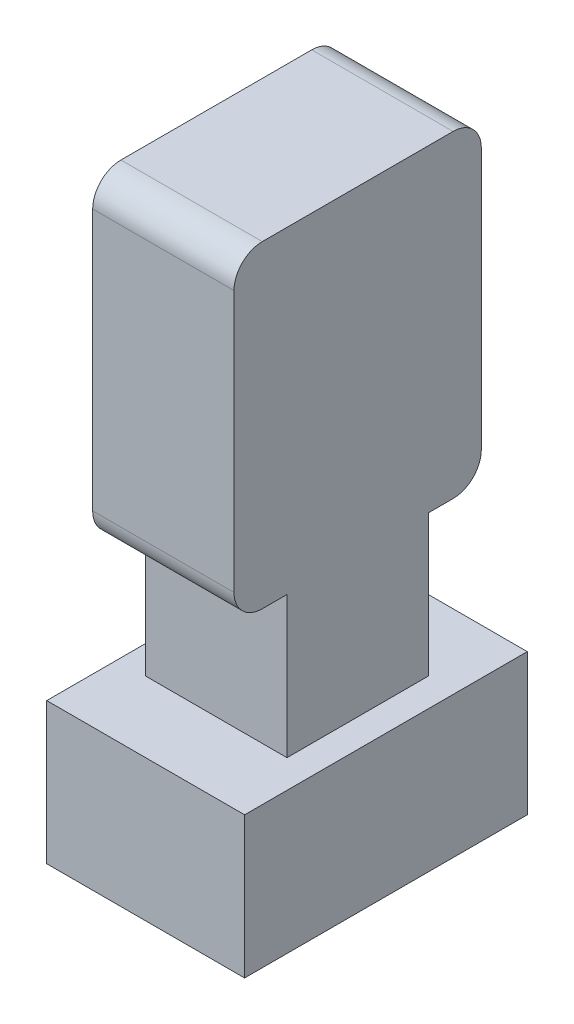
ISO-10303-21;
HEADER;
FILE_DESCRIPTION(('STEP AP214'),'2;1');
FILE_NAME('part.step','',(''),(''),'','','');
FILE_SCHEMA(('AUTOMOTIVE_DESIGN { 1 0 10303 214 1 1 1 1 }'));
ENDSEC;
DATA;
#1=APPLICATION_CONTEXT('core data for automotive mechanical design processes');
#2=APPLICATION_PROTOCOL_DEFINITION('international standard','automotive_design',2000,#1);
#3=PRODUCT_CONTEXT('',#1,'mechanical');
#4=PRODUCT('Part','Part','',(#3));
#5=PRODUCT_RELATED_PRODUCT_CATEGORY('part','',(#4));
#6=PRODUCT_DEFINITION_FORMATION('','',#4);
#7=PRODUCT_DEFINITION_CONTEXT('part definition',#1,'design');
#8=PRODUCT_DEFINITION('design','',#6,#7);
#9=PRODUCT_DEFINITION_SHAPE('','',#8);
#10=(LENGTH_UNIT() NAMED_UNIT(*) SI_UNIT(.MILLI.,.METRE.));
#11=(NAMED_UNIT(*) PLANE_ANGLE_UNIT() SI_UNIT($,.RADIAN.));
#12=(NAMED_UNIT(*) SI_UNIT($,.STERADIAN.) SOLID_ANGLE_UNIT());
#13=UNCERTAINTY_MEASURE_WITH_UNIT(LENGTH_MEASURE(1.E-05),#10,'distance_accuracy_value','');
#14=(GEOMETRIC_REPRESENTATION_CONTEXT(3) GLOBAL_UNCERTAINTY_ASSIGNED_CONTEXT((#13)) GLOBAL_UNIT_ASSIGNED_CONTEXT((#10,
#11,#12)) REPRESENTATION_CONTEXT('',''));
#15=CARTESIAN_POINT('',(0.,0.,0.));
#16=DIRECTION('',(0.,0.,1.));
#17=DIRECTION('',(1.,0.,0.));
#18=AXIS2_PLACEMENT_3D('',#15,#16,#17);
#19=CARTESIAN_POINT('',(0.,10.,0.));
#20=DIRECTION('',(0.,-1.,0.));
#21=DIRECTION('',(0.,0.,-1.));
#22=AXIS2_PLACEMENT_3D('',#19,#20,#21);
#23=PLANE('',#22);
#24=DIRECTION('',(0.,0.,1.));
#25=VECTOR('',#24,1.);
#26=CARTESIAN_POINT('',(0.,10.,0.));
#27=LINE('',#26,#25);
#28=CARTESIAN_POINT('',(0.,10.,-20.));
#29=VERTEX_POINT('',#28);
#30=CARTESIAN_POINT('',(0.,10.,0.));
#31=VERTEX_POINT('',#30);
#32=EDGE_CURVE('E227',#29,#31,#27,.T.);
#33=ORIENTED_EDGE('',*,*,#32,.T.);
#34=DIRECTION('',(1.,0.,0.));
#35=VECTOR('',#34,1.);
#36=CARTESIAN_POINT('',(0.,10.,0.));
#37=LINE('',#36,#35);
#38=CARTESIAN_POINT('',(14.,10.,0.));
#39=VERTEX_POINT('',#38);
#40=EDGE_CURVE('E231',#31,#39,#37,.T.);
#41=ORIENTED_EDGE('',*,*,#40,.T.);
#42=DIRECTION('',(0.,0.,-1.));
#43=VECTOR('',#42,1.);
#44=CARTESIAN_POINT('',(14.,10.,0.));
#45=LINE('',#44,#43);
#46=CARTESIAN_POINT('',(14.,10.,-20.));
#47=VERTEX_POINT('',#46);
#48=EDGE_CURVE('E235',#39,#47,#45,.T.);
#49=ORIENTED_EDGE('',*,*,#48,.T.);
#50=DIRECTION('',(-1.,0.,0.));
#51=VECTOR('',#50,1.);
#52=CARTESIAN_POINT('',(0.,10.,-20.));
#53=LINE('',#52,#51);
#54=EDGE_CURVE('E238',#47,#29,#53,.T.);
#55=ORIENTED_EDGE('',*,*,#54,.T.);
#56=EDGE_LOOP('',(#33,#41,#49,#55));
#57=FACE_BOUND('',#56,.T.);
#58=DIRECTION('',(0.,0.,-1.));
#59=VECTOR('',#58,1.);
#60=CARTESIAN_POINT('',(12.,10.,-15.));
#61=LINE('',#60,#59);
#62=CARTESIAN_POINT('',(12.,10.,-5.));
#63=VERTEX_POINT('',#62);
#64=CARTESIAN_POINT('',(12.,10.,-15.));
#65=VERTEX_POINT('',#64);
#66=EDGE_CURVE('E59',#63,#65,#61,.T.);
#67=ORIENTED_EDGE('',*,*,#66,.F.);
#68=DIRECTION('',(1.,0.,0.));
#69=VECTOR('',#68,1.);
#70=CARTESIAN_POINT('',(2.,10.,-5.));
#71=LINE('',#70,#69);
#72=CARTESIAN_POINT('',(2.,10.,-5.));
#73=VERTEX_POINT('',#72);
#74=EDGE_CURVE('E63',#73,#63,#71,.T.);
#75=ORIENTED_EDGE('',*,*,#74,.F.);
#76=DIRECTION('',(0.,0.,1.));
#77=VECTOR('',#76,1.);
#78=CARTESIAN_POINT('',(2.,10.,-15.));
#79=LINE('',#78,#77);
#80=CARTESIAN_POINT('',(2.,10.,-15.));
#81=VERTEX_POINT('',#80);
#82=EDGE_CURVE('E206',#81,#73,#79,.T.);
#83=ORIENTED_EDGE('',*,*,#82,.F.);
#84=DIRECTION('',(-1.,0.,0.));
#85=VECTOR('',#84,1.);
#86=CARTESIAN_POINT('',(2.,10.,-15.));
#87=LINE('',#86,#85);
#88=EDGE_CURVE('E187',#65,#81,#87,.T.);
#89=ORIENTED_EDGE('',*,*,#88,.F.);
#90=EDGE_LOOP('',(#67,#75,#83,#89));
#91=FACE_BOUND('',#90,.T.);
#92=ADVANCED_FACE('F43',(#57,#91),#23,.F.);
#93=CARTESIAN_POINT('',(0.,10.,0.));
#94=DIRECTION('',(1.,0.,0.));
#95=DIRECTION('',(0.,0.,-1.));
#96=AXIS2_PLACEMENT_3D('',#93,#94,#95);
#97=PLANE('',#96);
#98=DIRECTION('',(0.,0.,1.));
#99=VECTOR('',#98,1.);
#100=CARTESIAN_POINT('',(0.,0.,0.));
#101=LINE('',#100,#99);
#102=CARTESIAN_POINT('',(0.,0.,-20.));
#103=VERTEX_POINT('',#102);
#104=CARTESIAN_POINT('',(0.,0.,0.));
#105=VERTEX_POINT('',#104);
#106=EDGE_CURVE('E226',#103,#105,#101,.T.);
#107=ORIENTED_EDGE('',*,*,#106,.T.);
#108=DIRECTION('',(0.,-1.,0.));
#109=VECTOR('',#108,1.);
#110=CARTESIAN_POINT('',(0.,10.,0.));
#111=LINE('',#110,#109);
#112=EDGE_CURVE('E11',#31,#105,#111,.T.);
#113=ORIENTED_EDGE('',*,*,#112,.F.);
#114=ORIENTED_EDGE('',*,*,#32,.F.);
#115=DIRECTION('',(0.,-1.,0.));
#116=VECTOR('',#115,1.);
#117=CARTESIAN_POINT('',(0.,10.,-20.));
#118=LINE('',#117,#116);
#119=EDGE_CURVE('E241',#29,#103,#118,.T.);
#120=ORIENTED_EDGE('',*,*,#119,.T.);
#121=EDGE_LOOP('',(#107,#113,#114,#120));
#122=FACE_BOUND('',#121,.T.);
#123=ADVANCED_FACE('F45',(#122),#97,.F.);
#124=CARTESIAN_POINT('',(0.,10.,0.));
#125=DIRECTION('',(0.,0.,-1.));
#126=DIRECTION('',(-1.,0.,0.));
#127=AXIS2_PLACEMENT_3D('',#124,#125,#126);
#128=PLANE('',#127);
#129=DIRECTION('',(1.,0.,0.));
#130=VECTOR('',#129,1.);
#131=CARTESIAN_POINT('',(0.,0.,0.));
#132=LINE('',#131,#130);
#133=CARTESIAN_POINT('',(14.,0.,0.));
#134=VERTEX_POINT('',#133);
#135=EDGE_CURVE('E245',#105,#134,#132,.T.);
#136=ORIENTED_EDGE('',*,*,#135,.T.);
#137=DIRECTION('',(0.,-1.,0.));
#138=VECTOR('',#137,1.);
#139=CARTESIAN_POINT('',(14.,10.,0.));
#140=LINE('',#139,#138);
#141=EDGE_CURVE('E52',#39,#134,#140,.T.);
#142=ORIENTED_EDGE('',*,*,#141,.F.);
#143=ORIENTED_EDGE('',*,*,#40,.F.);
#144=ORIENTED_EDGE('',*,*,#112,.T.);
#145=EDGE_LOOP('',(#136,#142,#143,#144));
#146=FACE_BOUND('',#145,.T.);
#147=ADVANCED_FACE('F282',(#146),#128,.F.);
#148=CARTESIAN_POINT('',(14.,10.,0.));
#149=DIRECTION('',(-1.,0.,0.));
#150=DIRECTION('',(0.,0.,1.));
#151=AXIS2_PLACEMENT_3D('',#148,#149,#150);
#152=PLANE('',#151);
#153=DIRECTION('',(0.,0.,-1.));
#154=VECTOR('',#153,1.);
#155=CARTESIAN_POINT('',(14.,0.,0.));
#156=LINE('',#155,#154);
#157=CARTESIAN_POINT('',(14.,0.,-20.));
#158=VERTEX_POINT('',#157);
#159=EDGE_CURVE('E248',#134,#158,#156,.T.);
#160=ORIENTED_EDGE('',*,*,#159,.T.);
#161=DIRECTION('',(0.,-1.,0.));
#162=VECTOR('',#161,1.);
#163=CARTESIAN_POINT('',(14.,10.,-20.));
#164=LINE('',#163,#162);
#165=EDGE_CURVE('E256',#47,#158,#164,.T.);
#166=ORIENTED_EDGE('',*,*,#165,.F.);
#167=ORIENTED_EDGE('',*,*,#48,.F.);
#168=ORIENTED_EDGE('',*,*,#141,.T.);
#169=EDGE_LOOP('',(#160,#166,#167,#168));
#170=FACE_BOUND('',#169,.T.);
#171=ADVANCED_FACE('F267',(#170),#152,.F.);
#172=CARTESIAN_POINT('',(0.,10.,-20.));
#173=DIRECTION('',(0.,0.,1.));
#174=DIRECTION('',(1.,0.,0.));
#175=AXIS2_PLACEMENT_3D('',#172,#173,#174);
#176=PLANE('',#175);
#177=DIRECTION('',(-1.,0.,0.));
#178=VECTOR('',#177,1.);
#179=CARTESIAN_POINT('',(0.,0.,-20.));
#180=LINE('',#179,#178);
#181=EDGE_CURVE('E232',#158,#103,#180,.T.);
#182=ORIENTED_EDGE('',*,*,#181,.T.);
#183=ORIENTED_EDGE('',*,*,#119,.F.);
#184=ORIENTED_EDGE('',*,*,#54,.F.);
#185=ORIENTED_EDGE('',*,*,#165,.T.);
#186=EDGE_LOOP('',(#182,#183,#184,#185));
#187=FACE_BOUND('',#186,.T.);
#188=ADVANCED_FACE('F276',(#187),#176,.F.);
#189=CARTESIAN_POINT('',(0.,0.,0.));
#190=DIRECTION('',(0.,-1.,0.));
#191=DIRECTION('',(0.,0.,-1.));
#192=AXIS2_PLACEMENT_3D('',#189,#190,#191);
#193=PLANE('',#192);
#194=ORIENTED_EDGE('',*,*,#106,.F.);
#195=ORIENTED_EDGE('',*,*,#181,.F.);
#196=ORIENTED_EDGE('',*,*,#159,.F.);
#197=ORIENTED_EDGE('',*,*,#135,.F.);
#198=EDGE_LOOP('',(#194,#195,#196,#197));
#199=FACE_BOUND('',#198,.T.);
#200=ADVANCED_FACE('F273',(#199),#193,.T.);
#201=CARTESIAN_POINT('',(12.,20.,-15.));
#202=DIRECTION('',(-1.,0.,0.));
#203=DIRECTION('',(0.,0.,1.));
#204=AXIS2_PLACEMENT_3D('',#201,#202,#203);
#205=PLANE('',#204);
#206=ORIENTED_EDGE('',*,*,#66,.T.);
#207=DIRECTION('',(0.,-1.,0.));
#208=VECTOR('',#207,1.);
#209=CARTESIAN_POINT('',(12.,20.,-15.));
#210=LINE('',#209,#208);
#211=CARTESIAN_POINT('',(12.,20.,-15.));
#212=VERTEX_POINT('',#211);
#213=EDGE_CURVE('E222',#212,#65,#210,.T.);
#214=ORIENTED_EDGE('',*,*,#213,.F.);
#215=DIRECTION('',(0.,0.,-1.));
#216=VECTOR('',#215,1.);
#217=CARTESIAN_POINT('',(12.,20.,-16.75));
#218=LINE('',#217,#216);
#219=CARTESIAN_POINT('',(12.,20.,-16.75));
#220=VERTEX_POINT('',#219);
#221=EDGE_CURVE('E540',#212,#220,#218,.T.);
#222=ORIENTED_EDGE('',*,*,#221,.T.);
#223=CARTESIAN_POINT('',(12.,22.,-16.75));
#224=DIRECTION('',(1.,0.,0.));
#225=DIRECTION('',(0.,0.,1.));
#226=AXIS2_PLACEMENT_3D('',#223,#224,#225);
#227=CIRCLE('',#226,2.);
#228=CARTESIAN_POINT('',(12.,22.,-18.75));
#229=VERTEX_POINT('',#228);
#230=EDGE_CURVE('E539',#220,#229,#227,.T.);
#231=ORIENTED_EDGE('',*,*,#230,.T.);
#232=DIRECTION('',(0.,1.,0.));
#233=VECTOR('',#232,1.);
#234=CARTESIAN_POINT('',(12.,40.5,-18.75));
#235=LINE('',#234,#233);
#236=CARTESIAN_POINT('',(12.,40.5,-18.75));
#237=VERTEX_POINT('',#236);
#238=EDGE_CURVE('E172',#229,#237,#235,.T.);
#239=ORIENTED_EDGE('',*,*,#238,.T.);
#240=CARTESIAN_POINT('',(12.,40.5,-16.75));
#241=DIRECTION('',(1.,0.,0.));
#242=DIRECTION('',(0.,0.,1.));
#243=AXIS2_PLACEMENT_3D('',#240,#241,#242);
#244=CIRCLE('',#243,1.99999999999999);
#245=CARTESIAN_POINT('',(12.,42.5,-16.75));
#246=VERTEX_POINT('',#245);
#247=EDGE_CURVE('E167',#237,#246,#244,.T.);
#248=ORIENTED_EDGE('',*,*,#247,.T.);
#249=DIRECTION('',(0.,0.,1.));
#250=VECTOR('',#249,1.);
#251=CARTESIAN_POINT('',(12.,42.5,-3.24999999999999));
#252=LINE('',#251,#250);
#253=CARTESIAN_POINT('',(12.,42.5,-3.24999999999999));
#254=VERTEX_POINT('',#253);
#255=EDGE_CURVE('E155',#246,#254,#252,.T.);
#256=ORIENTED_EDGE('',*,*,#255,.T.);
#257=CARTESIAN_POINT('',(12.,40.5,-3.24999999999999));
#258=DIRECTION('',(1.,0.,0.));
#259=DIRECTION('',(0.,0.,1.));
#260=AXIS2_PLACEMENT_3D('',#257,#258,#259);
#261=CIRCLE('',#260,1.99999999999999);
#262=CARTESIAN_POINT('',(12.,40.5,-1.25));
#263=VERTEX_POINT('',#262);
#264=EDGE_CURVE('E166',#254,#263,#261,.T.);
#265=ORIENTED_EDGE('',*,*,#264,.T.);
#266=DIRECTION('',(0.,-1.,0.));
#267=VECTOR('',#266,1.);
#268=CARTESIAN_POINT('',(12.,22.,-1.25));
#269=LINE('',#268,#267);
#270=CARTESIAN_POINT('',(12.,22.,-1.25));
#271=VERTEX_POINT('',#270);
#272=EDGE_CURVE('E530',#263,#271,#269,.T.);
#273=ORIENTED_EDGE('',*,*,#272,.T.);
#274=CARTESIAN_POINT('',(12.,22.,-3.25));
#275=DIRECTION('',(1.,0.,0.));
#276=DIRECTION('',(0.,0.,1.));
#277=AXIS2_PLACEMENT_3D('',#274,#275,#276);
#278=CIRCLE('',#277,2.);
#279=CARTESIAN_POINT('',(12.,20.,-3.25000000000001));
#280=VERTEX_POINT('',#279);
#281=EDGE_CURVE('E543',#271,#280,#278,.T.);
#282=ORIENTED_EDGE('',*,*,#281,.T.);
#283=CARTESIAN_POINT('',(12.,20.,-5.));
#284=VERTEX_POINT('',#283);
#285=EDGE_CURVE('E538',#280,#284,#218,.T.);
#286=ORIENTED_EDGE('',*,*,#285,.T.);
#287=DIRECTION('',(0.,-1.,0.));
#288=VECTOR('',#287,1.);
#289=CARTESIAN_POINT('',(12.,20.,-5.));
#290=LINE('',#289,#288);
#291=EDGE_CURVE('E201',#284,#63,#290,.T.);
#292=ORIENTED_EDGE('',*,*,#291,.T.);
#293=EDGE_LOOP('',(#206,#214,#222,#231,#239,#248,#256,#265,#273,#282,#286,#292));
#294=FACE_BOUND('',#293,.T.);
#295=ADVANCED_FACE('F170',(#294),#205,.F.);
#296=CARTESIAN_POINT('',(2.,20.,-15.));
#297=DIRECTION('',(0.,0.,1.));
#298=DIRECTION('',(1.,0.,0.));
#299=AXIS2_PLACEMENT_3D('',#296,#297,#298);
#300=PLANE('',#299);
#301=ORIENTED_EDGE('',*,*,#88,.T.);
#302=DIRECTION('',(0.,-1.,0.));
#303=VECTOR('',#302,1.);
#304=CARTESIAN_POINT('',(2.,20.,-15.));
#305=LINE('',#304,#303);
#306=CARTESIAN_POINT('',(2.,20.,-15.));
#307=VERTEX_POINT('',#306);
#308=EDGE_CURVE('E218',#307,#81,#305,.T.);
#309=ORIENTED_EDGE('',*,*,#308,.F.);
#310=DIRECTION('',(-1.,0.,0.));
#311=VECTOR('',#310,1.);
#312=CARTESIAN_POINT('',(2.,20.,-15.));
#313=LINE('',#312,#311);
#314=EDGE_CURVE('E194',#212,#307,#313,.T.);
#315=ORIENTED_EDGE('',*,*,#314,.F.);
#316=ORIENTED_EDGE('',*,*,#213,.T.);
#317=EDGE_LOOP('',(#301,#309,#315,#316));
#318=FACE_BOUND('',#317,.T.);
#319=ADVANCED_FACE('F307',(#318),#300,.F.);
#320=CARTESIAN_POINT('',(2.,20.,-15.));
#321=DIRECTION('',(1.,0.,0.));
#322=DIRECTION('',(0.,0.,-1.));
#323=AXIS2_PLACEMENT_3D('',#320,#321,#322);
#324=PLANE('',#323);
#325=ORIENTED_EDGE('',*,*,#82,.T.);
#326=DIRECTION('',(0.,-1.,0.));
#327=VECTOR('',#326,1.);
#328=CARTESIAN_POINT('',(2.,20.,-5.));
#329=LINE('',#328,#327);
#330=CARTESIAN_POINT('',(2.,20.,-5.));
#331=VERTEX_POINT('',#330);
#332=EDGE_CURVE('E214',#331,#73,#329,.T.);
#333=ORIENTED_EDGE('',*,*,#332,.F.);
#334=DIRECTION('',(0.,0.,-1.));
#335=VECTOR('',#334,1.);
#336=CARTESIAN_POINT('',(2.,20.,-16.75));
#337=LINE('',#336,#335);
#338=CARTESIAN_POINT('',(2.,20.,-3.25000000000001));
#339=VERTEX_POINT('',#338);
#340=EDGE_CURVE('E505',#339,#331,#337,.T.);
#341=ORIENTED_EDGE('',*,*,#340,.F.);
#342=CARTESIAN_POINT('',(2.,22.,-3.25));
#343=DIRECTION('',(1.,0.,0.));
#344=DIRECTION('',(0.,0.,1.));
#345=AXIS2_PLACEMENT_3D('',#342,#343,#344);
#346=CIRCLE('',#345,2.);
#347=CARTESIAN_POINT('',(2.,22.,-1.25));
#348=VERTEX_POINT('',#347);
#349=EDGE_CURVE('E502',#348,#339,#346,.T.);
#350=ORIENTED_EDGE('',*,*,#349,.F.);
#351=DIRECTION('',(0.,-1.,0.));
#352=VECTOR('',#351,1.);
#353=CARTESIAN_POINT('',(2.,22.,-1.25));
#354=LINE('',#353,#352);
#355=CARTESIAN_POINT('',(2.,40.5,-1.25));
#356=VERTEX_POINT('',#355);
#357=EDGE_CURVE('E499',#356,#348,#354,.T.);
#358=ORIENTED_EDGE('',*,*,#357,.F.);
#359=CARTESIAN_POINT('',(2.,40.5,-3.24999999999999));
#360=DIRECTION('',(1.,0.,0.));
#361=DIRECTION('',(0.,0.,1.));
#362=AXIS2_PLACEMENT_3D('',#359,#360,#361);
#363=CIRCLE('',#362,1.99999999999999);
#364=CARTESIAN_POINT('',(2.,42.5,-3.24999999999999));
#365=VERTEX_POINT('',#364);
#366=EDGE_CURVE('E492',#365,#356,#363,.T.);
#367=ORIENTED_EDGE('',*,*,#366,.F.);
#368=DIRECTION('',(0.,0.,1.));
#369=VECTOR('',#368,1.);
#370=CARTESIAN_POINT('',(2.,42.5,-3.24999999999999));
#371=LINE('',#370,#369);
#372=CARTESIAN_POINT('',(2.,42.5,-16.75));
#373=VERTEX_POINT('',#372);
#374=EDGE_CURVE('E489',#373,#365,#371,.T.);
#375=ORIENTED_EDGE('',*,*,#374,.F.);
#376=CARTESIAN_POINT('',(2.,40.5,-16.75));
#377=DIRECTION('',(1.,0.,0.));
#378=DIRECTION('',(0.,0.,1.));
#379=AXIS2_PLACEMENT_3D('',#376,#377,#378);
#380=CIRCLE('',#379,1.99999999999999);
#381=CARTESIAN_POINT('',(2.,40.5,-18.75));
#382=VERTEX_POINT('',#381);
#383=EDGE_CURVE('E181',#382,#373,#380,.T.);
#384=ORIENTED_EDGE('',*,*,#383,.F.);
#385=DIRECTION('',(0.,1.,0.));
#386=VECTOR('',#385,1.);
#387=CARTESIAN_POINT('',(2.,40.5,-18.75));
#388=LINE('',#387,#386);
#389=CARTESIAN_POINT('',(2.,22.,-18.75));
#390=VERTEX_POINT('',#389);
#391=EDGE_CURVE('E177',#390,#382,#388,.T.);
#392=ORIENTED_EDGE('',*,*,#391,.F.);
#393=CARTESIAN_POINT('',(2.,22.,-16.75));
#394=DIRECTION('',(1.,0.,0.));
#395=DIRECTION('',(0.,0.,1.));
#396=AXIS2_PLACEMENT_3D('',#393,#394,#395);
#397=CIRCLE('',#396,2.);
#398=CARTESIAN_POINT('',(2.,20.,-16.75));
#399=VERTEX_POINT('',#398);
#400=EDGE_CURVE('E484',#399,#390,#397,.T.);
#401=ORIENTED_EDGE('',*,*,#400,.F.);
#402=EDGE_CURVE('E504',#307,#399,#337,.T.);
#403=ORIENTED_EDGE('',*,*,#402,.F.);
#404=ORIENTED_EDGE('',*,*,#308,.T.);
#405=EDGE_LOOP('',(#325,#333,#341,#350,#358,#367,#375,#384,#392,#401,#403,#404));
#406=FACE_BOUND('',#405,.T.);
#407=ADVANCED_FACE('F312',(#406),#324,.F.);
#408=CARTESIAN_POINT('',(2.,20.,-5.));
#409=DIRECTION('',(0.,0.,-1.));
#410=DIRECTION('',(-1.,0.,0.));
#411=AXIS2_PLACEMENT_3D('',#408,#409,#410);
#412=PLANE('',#411);
#413=ORIENTED_EDGE('',*,*,#74,.T.);
#414=ORIENTED_EDGE('',*,*,#291,.F.);
#415=DIRECTION('',(1.,0.,0.));
#416=VECTOR('',#415,1.);
#417=CARTESIAN_POINT('',(2.,20.,-5.));
#418=LINE('',#417,#416);
#419=EDGE_CURVE('E198',#331,#284,#418,.T.);
#420=ORIENTED_EDGE('',*,*,#419,.F.);
#421=ORIENTED_EDGE('',*,*,#332,.T.);
#422=EDGE_LOOP('',(#413,#414,#420,#421));
#423=FACE_BOUND('',#422,.T.);
#424=ADVANCED_FACE('F318',(#423),#412,.F.);
#425=CARTESIAN_POINT('',(12.,20.,-16.75));
#426=DIRECTION('',(0.,1.,0.));
#427=DIRECTION('',(0.,0.,1.));
#428=AXIS2_PLACEMENT_3D('',#425,#426,#427);
#429=PLANE('',#428);
#430=ORIENTED_EDGE('',*,*,#221,.F.);
#431=ORIENTED_EDGE('',*,*,#314,.T.);
#432=ORIENTED_EDGE('',*,*,#402,.T.);
#433=DIRECTION('',(-1.,0.,0.));
#434=VECTOR('',#433,1.);
#435=CARTESIAN_POINT('',(12.,20.,-16.75));
#436=LINE('',#435,#434);
#437=EDGE_CURVE('E512',#220,#399,#436,.T.);
#438=ORIENTED_EDGE('',*,*,#437,.F.);
#439=EDGE_LOOP('',(#430,#431,#432,#438));
#440=FACE_BOUND('',#439,.T.);
#441=ADVANCED_FACE('F325',(#440),#429,.F.);
#442=ORIENTED_EDGE('',*,*,#340,.T.);
#443=ORIENTED_EDGE('',*,*,#419,.T.);
#444=ORIENTED_EDGE('',*,*,#285,.F.);
#445=DIRECTION('',(-1.,0.,0.));
#446=VECTOR('',#445,1.);
#447=CARTESIAN_POINT('',(12.,20.,-3.25000000000001));
#448=LINE('',#447,#446);
#449=EDGE_CURVE('E516',#280,#339,#448,.T.);
#450=ORIENTED_EDGE('',*,*,#449,.T.);
#451=EDGE_LOOP('',(#442,#443,#444,#450));
#452=FACE_BOUND('',#451,.T.);
#453=ADVANCED_FACE('F332',(#452),#429,.F.);
#454=CARTESIAN_POINT('',(12.,40.5,-16.75));
#455=DIRECTION('',(-1.,0.,0.));
#456=DIRECTION('',(0.,0.,1.));
#457=AXIS2_PLACEMENT_3D('',#454,#455,#456);
#458=CYLINDRICAL_SURFACE('',#457,1.99999999999999);
#459=ORIENTED_EDGE('',*,*,#383,.T.);
#460=DIRECTION('',(-1.,0.,0.));
#461=VECTOR('',#460,1.);
#462=CARTESIAN_POINT('',(12.,42.5,-16.75));
#463=LINE('',#462,#461);
#464=EDGE_CURVE('E159',#246,#373,#463,.T.);
#465=ORIENTED_EDGE('',*,*,#464,.F.);
#466=ORIENTED_EDGE('',*,*,#247,.F.);
#467=DIRECTION('',(-1.,0.,0.));
#468=VECTOR('',#467,1.);
#469=CARTESIAN_POINT('',(12.,40.5,-18.75));
#470=LINE('',#469,#468);
#471=EDGE_CURVE('E479',#237,#382,#470,.T.);
#472=ORIENTED_EDGE('',*,*,#471,.T.);
#473=EDGE_LOOP('',(#459,#465,#466,#472));
#474=FACE_BOUND('',#473,.T.);
#475=ADVANCED_FACE('F179',(#474),#458,.T.);
#476=CARTESIAN_POINT('',(12.,42.5,-3.24999999999999));
#477=DIRECTION('',(0.,-1.,0.));
#478=DIRECTION('',(0.,0.,-1.));
#479=AXIS2_PLACEMENT_3D('',#476,#477,#478);
#480=PLANE('',#479);
#481=ORIENTED_EDGE('',*,*,#374,.T.);
#482=DIRECTION('',(-1.,0.,0.));
#483=VECTOR('',#482,1.);
#484=CARTESIAN_POINT('',(12.,42.5,-3.24999999999999));
#485=LINE('',#484,#483);
#486=EDGE_CURVE('E162',#254,#365,#485,.T.);
#487=ORIENTED_EDGE('',*,*,#486,.F.);
#488=ORIENTED_EDGE('',*,*,#255,.F.);
#489=ORIENTED_EDGE('',*,*,#464,.T.);
#490=EDGE_LOOP('',(#481,#487,#488,#489));
#491=FACE_BOUND('',#490,.T.);
#492=ADVANCED_FACE('F157',(#491),#480,.F.);
#493=CARTESIAN_POINT('',(12.,40.5,-3.24999999999999));
#494=DIRECTION('',(-1.,0.,0.));
#495=DIRECTION('',(0.,0.,1.));
#496=AXIS2_PLACEMENT_3D('',#493,#494,#495);
#497=CYLINDRICAL_SURFACE('',#496,1.99999999999999);
#498=ORIENTED_EDGE('',*,*,#366,.T.);
#499=DIRECTION('',(-1.,0.,0.));
#500=VECTOR('',#499,1.);
#501=CARTESIAN_POINT('',(12.,40.5,-1.25));
#502=LINE('',#501,#500);
#503=EDGE_CURVE('E190',#263,#356,#502,.T.);
#504=ORIENTED_EDGE('',*,*,#503,.F.);
#505=ORIENTED_EDGE('',*,*,#264,.F.);
#506=ORIENTED_EDGE('',*,*,#486,.T.);
#507=EDGE_LOOP('',(#498,#504,#505,#506));
#508=FACE_BOUND('',#507,.T.);
#509=ADVANCED_FACE('F349',(#508),#497,.T.);
#510=CARTESIAN_POINT('',(12.,22.,-1.25));
#511=DIRECTION('',(0.,0.,-1.));
#512=DIRECTION('',(0.,1.,0.));
#513=AXIS2_PLACEMENT_3D('',#510,#511,#512);
#514=PLANE('',#513);
#515=ORIENTED_EDGE('',*,*,#357,.T.);
#516=DIRECTION('',(-1.,0.,0.));
#517=VECTOR('',#516,1.);
#518=CARTESIAN_POINT('',(12.,22.,-1.25));
#519=LINE('',#518,#517);
#520=EDGE_CURVE('E520',#271,#348,#519,.T.);
#521=ORIENTED_EDGE('',*,*,#520,.F.);
#522=ORIENTED_EDGE('',*,*,#272,.F.);
#523=ORIENTED_EDGE('',*,*,#503,.T.);
#524=EDGE_LOOP('',(#515,#521,#522,#523));
#525=FACE_BOUND('',#524,.T.);
#526=ADVANCED_FACE('F355',(#525),#514,.F.);
#527=CARTESIAN_POINT('',(12.,22.,-3.25));
#528=DIRECTION('',(-1.,0.,0.));
#529=DIRECTION('',(0.,0.,1.));
#530=AXIS2_PLACEMENT_3D('',#527,#528,#529);
#531=CYLINDRICAL_SURFACE('',#530,2.);
#532=ORIENTED_EDGE('',*,*,#349,.T.);
#533=ORIENTED_EDGE('',*,*,#449,.F.);
#534=ORIENTED_EDGE('',*,*,#281,.F.);
#535=ORIENTED_EDGE('',*,*,#520,.T.);
#536=EDGE_LOOP('',(#532,#533,#534,#535));
#537=FACE_BOUND('',#536,.T.);
#538=ADVANCED_FACE('F362',(#537),#531,.T.);
#539=CARTESIAN_POINT('',(12.,22.,-16.75));
#540=DIRECTION('',(-1.,0.,0.));
#541=DIRECTION('',(0.,0.,1.));
#542=AXIS2_PLACEMENT_3D('',#539,#540,#541);
#543=CYLINDRICAL_SURFACE('',#542,2.);
#544=ORIENTED_EDGE('',*,*,#400,.T.);
#545=DIRECTION('',(-1.,0.,0.));
#546=VECTOR('',#545,1.);
#547=CARTESIAN_POINT('',(12.,22.,-18.75));
#548=LINE('',#547,#546);
#549=EDGE_CURVE('E481',#229,#390,#548,.T.);
#550=ORIENTED_EDGE('',*,*,#549,.F.);
#551=ORIENTED_EDGE('',*,*,#230,.F.);
#552=ORIENTED_EDGE('',*,*,#437,.T.);
#553=EDGE_LOOP('',(#544,#550,#551,#552));
#554=FACE_BOUND('',#553,.T.);
#555=ADVANCED_FACE('F369',(#554),#543,.T.);
#556=CARTESIAN_POINT('',(12.,40.5,-18.75));
#557=DIRECTION('',(0.,0.,1.));
#558=DIRECTION('',(0.,-1.,0.));
#559=AXIS2_PLACEMENT_3D('',#556,#557,#558);
#560=PLANE('',#559);
#561=ORIENTED_EDGE('',*,*,#391,.T.);
#562=ORIENTED_EDGE('',*,*,#471,.F.);
#563=ORIENTED_EDGE('',*,*,#238,.F.);
#564=ORIENTED_EDGE('',*,*,#549,.T.);
#565=EDGE_LOOP('',(#561,#562,#563,#564));
#566=FACE_BOUND('',#565,.T.);
#567=ADVANCED_FACE('F376',(#566),#560,.F.);
#568=CLOSED_SHELL('',(#92,#123,#147,#171,#188,#200,#295,#319,#407,#424,#441,#453,#475,#492,#509,
#526,#538,#555,#567));
#569=MANIFOLD_SOLID_BREP('B2',#568);
#570=ADVANCED_BREP_SHAPE_REPRESENTATION('',(#18,#569),#14);
#571=SHAPE_DEFINITION_REPRESENTATION(#9,#570);
ENDSEC;
END-ISO-10303-21;
